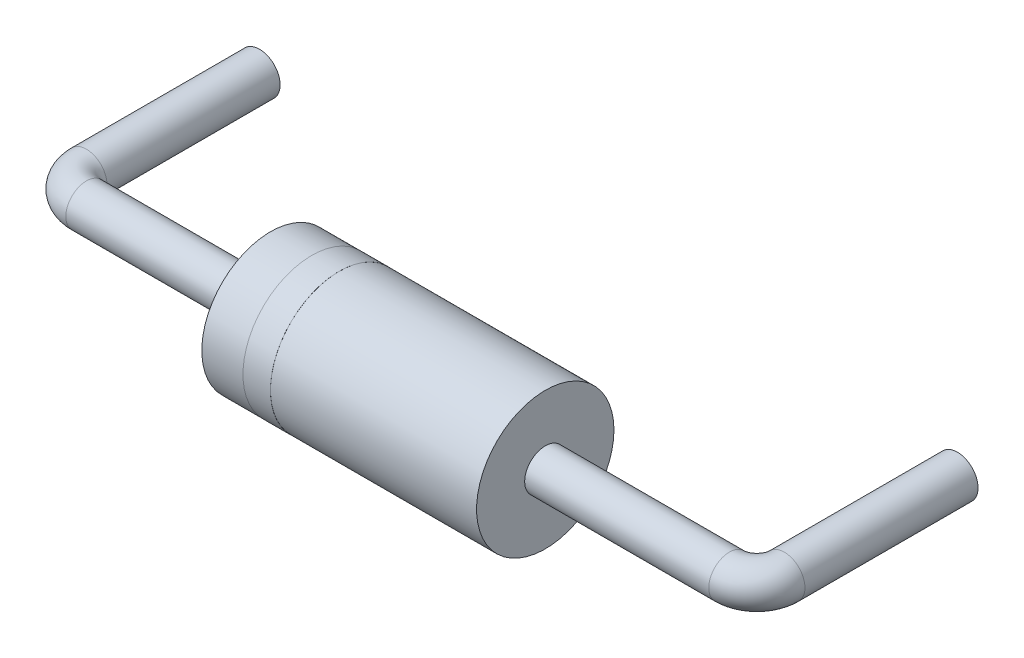
ISO-10303-21;
HEADER;
FILE_DESCRIPTION(('STEP AP214'),'2;1');
FILE_NAME('part.step','',(''),(''),'','','');
FILE_SCHEMA(('AUTOMOTIVE_DESIGN { 1 0 10303 214 1 1 1 1 }'));
ENDSEC;
DATA;
#1=APPLICATION_CONTEXT('core data for automotive mechanical design processes');
#2=APPLICATION_PROTOCOL_DEFINITION('international standard','automotive_design',2000,#1);
#3=PRODUCT_CONTEXT('',#1,'mechanical');
#4=PRODUCT('Part','Part','',(#3));
#5=PRODUCT_RELATED_PRODUCT_CATEGORY('part','',(#4));
#6=PRODUCT_DEFINITION_FORMATION('','',#4);
#7=PRODUCT_DEFINITION_CONTEXT('part definition',#1,'design');
#8=PRODUCT_DEFINITION('design','',#6,#7);
#9=PRODUCT_DEFINITION_SHAPE('','',#8);
#10=(LENGTH_UNIT() NAMED_UNIT(*) SI_UNIT(.MILLI.,.METRE.));
#11=(NAMED_UNIT(*) PLANE_ANGLE_UNIT() SI_UNIT($,.RADIAN.));
#12=(NAMED_UNIT(*) SI_UNIT($,.STERADIAN.) SOLID_ANGLE_UNIT());
#13=UNCERTAINTY_MEASURE_WITH_UNIT(LENGTH_MEASURE(1.E-05),#10,'distance_accuracy_value','');
#14=(GEOMETRIC_REPRESENTATION_CONTEXT(3) GLOBAL_UNCERTAINTY_ASSIGNED_CONTEXT((#13)) GLOBAL_UNIT_ASSIGNED_CONTEXT((#10,
#11,#12)) REPRESENTATION_CONTEXT('',''));
#15=CARTESIAN_POINT('',(0.,0.,0.));
#16=DIRECTION('',(0.,0.,1.));
#17=DIRECTION('',(1.,0.,0.));
#18=AXIS2_PLACEMENT_3D('',#15,#16,#17);
#19=CARTESIAN_POINT('',(2.,0.,0.919999999999982));
#20=DIRECTION('',(1.,0.,0.));
#21=DIRECTION('',(0.,0.,-1.));
#22=AXIS2_PLACEMENT_3D('',#19,#20,#21);
#23=PLANE('',#22);
#24=CARTESIAN_POINT('',(2.,0.,0.919999999999982));
#25=DIRECTION('',(1.,0.,0.));
#26=DIRECTION('',(0.,0.,-1.));
#27=AXIS2_PLACEMENT_3D('',#24,#25,#26);
#28=CIRCLE('',#27,1.);
#29=CARTESIAN_POINT('',(2.,0.,-0.0800000000000184));
#30=VERTEX_POINT('',#29);
#31=EDGE_CURVE('E75',#30,#30,#28,.T.);
#32=ORIENTED_EDGE('',*,*,#31,.T.);
#33=EDGE_LOOP('',(#32));
#34=FACE_BOUND('',#33,.T.);
#35=CARTESIAN_POINT('',(2.,0.,0.919999999999993));
#36=DIRECTION('',(1.,0.,0.));
#37=DIRECTION('',(0.,0.,-1.));
#38=AXIS2_PLACEMENT_3D('',#35,#36,#37);
#39=CIRCLE('',#38,0.3);
#40=CARTESIAN_POINT('',(2.,0.,0.619999999999993));
#41=VERTEX_POINT('',#40);
#42=EDGE_CURVE('E57',#41,#41,#39,.T.);
#43=ORIENTED_EDGE('',*,*,#42,.F.);
#44=EDGE_LOOP('',(#43));
#45=FACE_BOUND('',#44,.T.);
#46=ADVANCED_FACE('F39',(#34,#45),#23,.T.);
#47=CARTESIAN_POINT('',(-2.,0.,0.919999999999982));
#48=DIRECTION('',(1.,0.,0.));
#49=DIRECTION('',(0.,0.,-1.));
#50=AXIS2_PLACEMENT_3D('',#47,#48,#49);
#51=CYLINDRICAL_SURFACE('',#50,1.);
#52=CARTESIAN_POINT('',(-1.,0.,0.919999999999982));
#53=DIRECTION('',(1.,0.,0.));
#54=DIRECTION('',(0.,0.,-1.));
#55=AXIS2_PLACEMENT_3D('',#52,#53,#54);
#56=CIRCLE('',#55,1.);
#57=CARTESIAN_POINT('',(-1.,0.,-0.0800000000000184));
#58=VERTEX_POINT('',#57);
#59=EDGE_CURVE('E11',#58,#58,#56,.F.);
#60=ORIENTED_EDGE('',*,*,#59,.F.);
#61=EDGE_LOOP('',(#60));
#62=FACE_BOUND('',#61,.T.);
#63=ORIENTED_EDGE('',*,*,#31,.F.);
#64=EDGE_LOOP('',(#63));
#65=FACE_BOUND('',#64,.T.);
#66=ADVANCED_FACE('F97',(#62,#65),#51,.T.);
#67=CARTESIAN_POINT('',(5.07999999999999,0.,-2.00000000000004));
#68=DIRECTION('',(0.,0.,-1.));
#69=DIRECTION('',(-1.,0.,0.));
#70=AXIS2_PLACEMENT_3D('',#67,#68,#69);
#71=PLANE('',#70);
#72=CARTESIAN_POINT('',(5.07999999999999,0.,-2.00000000000004));
#73=DIRECTION('',(0.,0.,-1.));
#74=DIRECTION('',(-1.,0.,0.));
#75=AXIS2_PLACEMENT_3D('',#72,#73,#74);
#76=CIRCLE('',#75,0.3);
#77=CARTESIAN_POINT('',(4.77999999999999,0.,-2.00000000000003));
#78=VERTEX_POINT('',#77);
#79=EDGE_CURVE('E59',#78,#78,#76,.T.);
#80=ORIENTED_EDGE('',*,*,#79,.T.);
#81=EDGE_LOOP('',(#80));
#82=FACE_BOUND('',#81,.T.);
#83=ADVANCED_FACE('F107',(#82),#71,.T.);
#84=CARTESIAN_POINT('',(5.07999999999999,0.,0.519999999999993));
#85=DIRECTION('',(0.,0.,-1.));
#86=DIRECTION('',(-1.,0.,0.));
#87=AXIS2_PLACEMENT_3D('',#84,#85,#86);
#88=CYLINDRICAL_SURFACE('',#87,0.3);
#89=CARTESIAN_POINT('',(5.07999999999999,0.,0.519999999999993));
#90=DIRECTION('',(0.,0.,-1.));
#91=DIRECTION('',(-1.,0.,0.));
#92=AXIS2_PLACEMENT_3D('',#89,#90,#91);
#93=CIRCLE('',#92,0.3);
#94=CARTESIAN_POINT('',(5.37999999999999,0.,0.519999999999993));
#95=VERTEX_POINT('',#94);
#96=EDGE_CURVE('E70',#95,#95,#93,.T.);
#97=ORIENTED_EDGE('',*,*,#96,.T.);
#98=EDGE_LOOP('',(#97));
#99=FACE_BOUND('',#98,.T.);
#100=ORIENTED_EDGE('',*,*,#79,.F.);
#101=EDGE_LOOP('',(#100));
#102=FACE_BOUND('',#101,.T.);
#103=ADVANCED_FACE('F139',(#99,#102),#88,.T.);
#104=CARTESIAN_POINT('',(4.67999999999999,0.,0.519999999999993));
#105=DIRECTION('',(0.,-1.,0.));
#106=DIRECTION('',(0.,0.,-1.));
#107=AXIS2_PLACEMENT_3D('',#104,#105,#106);
#108=TOROIDAL_SURFACE('',#107,0.4,0.3);
#109=CARTESIAN_POINT('',(4.67999999999999,0.,0.919999999999993));
#110=DIRECTION('',(1.,0.,0.));
#111=DIRECTION('',(0.,0.,-1.));
#112=AXIS2_PLACEMENT_3D('',#109,#110,#111);
#113=CIRCLE('',#112,0.3);
#114=CARTESIAN_POINT('',(4.67999999999998,0.,1.21999999999999));
#115=VERTEX_POINT('',#114);
#116=EDGE_CURVE('E67',#115,#115,#113,.T.);
#117=CARTESIAN_POINT('',(4.67999999999999,0.,0.519999999999993));
#118=DIRECTION('',(0.,-1.,0.));
#119=DIRECTION('',(0.,0.,-1.));
#120=AXIS2_PLACEMENT_3D('',#117,#118,#119);
#121=CIRCLE('',#120,0.7);
#122=EDGE_CURVE('',#95,#115,#121,.T.);
#123=ORIENTED_EDGE('',*,*,#96,.F.);
#124=ORIENTED_EDGE('',*,*,#116,.T.);
#125=ORIENTED_EDGE('',*,*,#122,.T.);
#126=ORIENTED_EDGE('',*,*,#122,.F.);
#127=EDGE_LOOP('',(#123,#125,#124,#126));
#128=FACE_BOUND('',#127,.T.);
#129=ADVANCED_FACE('F130',(#128),#108,.T.);
#130=CARTESIAN_POINT('',(4.67999999999999,0.,0.919999999999993));
#131=DIRECTION('',(-1.,0.,0.));
#132=DIRECTION('',(0.,0.,1.));
#133=AXIS2_PLACEMENT_3D('',#130,#131,#132);
#134=CYLINDRICAL_SURFACE('',#133,0.3);
#135=ORIENTED_EDGE('',*,*,#42,.T.);
#136=EDGE_LOOP('',(#135));
#137=FACE_BOUND('',#136,.T.);
#138=ORIENTED_EDGE('',*,*,#116,.F.);
#139=EDGE_LOOP('',(#138));
#140=FACE_BOUND('',#139,.T.);
#141=ADVANCED_FACE('F125',(#137,#140),#134,.T.);
#142=CARTESIAN_POINT('',(-1.,0.,0.919999999999982));
#143=DIRECTION('',(1.,0.,0.));
#144=DIRECTION('',(0.,0.,-1.));
#145=AXIS2_PLACEMENT_3D('',#142,#143,#144);
#146=PLANE('',#145);
#147=CARTESIAN_POINT('',(-1.,0.,0.919999999999982));
#148=DIRECTION('',(1.,0.,0.));
#149=DIRECTION('',(0.,0.,-1.));
#150=AXIS2_PLACEMENT_3D('',#147,#148,#149);
#151=CIRCLE('',#150,1.001);
#152=CARTESIAN_POINT('',(-1.,0.,-0.0810000000000183));
#153=VERTEX_POINT('',#152);
#154=EDGE_CURVE('E78',#153,#153,#151,.T.);
#155=ORIENTED_EDGE('',*,*,#154,.T.);
#156=EDGE_LOOP('',(#155));
#157=FACE_BOUND('',#156,.T.);
#158=ORIENTED_EDGE('',*,*,#59,.T.);
#159=EDGE_LOOP('',(#158));
#160=FACE_BOUND('',#159,.T.);
#161=ADVANCED_FACE('F122',(#157,#160),#146,.T.);
#162=CARTESIAN_POINT('',(-1.4,0.,0.919999999999982));
#163=DIRECTION('',(1.,0.,0.));
#164=DIRECTION('',(0.,0.,-1.));
#165=AXIS2_PLACEMENT_3D('',#162,#163,#164);
#166=PLANE('',#165);
#167=CARTESIAN_POINT('',(-1.4,0.,0.919999999999982));
#168=DIRECTION('',(1.,0.,0.));
#169=DIRECTION('',(0.,0.,-1.));
#170=AXIS2_PLACEMENT_3D('',#167,#168,#169);
#171=CIRCLE('',#170,1.001);
#172=CARTESIAN_POINT('',(-1.4,0.,-0.0810000000000183));
#173=VERTEX_POINT('',#172);
#174=EDGE_CURVE('E81',#173,#173,#171,.T.);
#175=ORIENTED_EDGE('',*,*,#174,.F.);
#176=EDGE_LOOP('',(#175));
#177=FACE_BOUND('',#176,.T.);
#178=CARTESIAN_POINT('',(-1.4,0.,0.919999999999982));
#179=DIRECTION('',(1.,0.,0.));
#180=DIRECTION('',(0.,0.,-1.));
#181=AXIS2_PLACEMENT_3D('',#178,#179,#180);
#182=CIRCLE('',#181,1.);
#183=CARTESIAN_POINT('',(-1.4,0.,-0.0800000000000184));
#184=VERTEX_POINT('',#183);
#185=EDGE_CURVE('E84',#184,#184,#182,.T.);
#186=ORIENTED_EDGE('',*,*,#185,.T.);
#187=EDGE_LOOP('',(#186));
#188=FACE_BOUND('',#187,.T.);
#189=ADVANCED_FACE('F90',(#177,#188),#166,.F.);
#190=CARTESIAN_POINT('',(-1.,0.,0.919999999999982));
#191=DIRECTION('',(-1.,0.,0.));
#192=DIRECTION('',(0.,0.,1.));
#193=AXIS2_PLACEMENT_3D('',#190,#191,#192);
#194=CYLINDRICAL_SURFACE('',#193,1.001);
#195=ORIENTED_EDGE('',*,*,#154,.F.);
#196=EDGE_LOOP('',(#195));
#197=FACE_BOUND('',#196,.T.);
#198=ORIENTED_EDGE('',*,*,#174,.T.);
#199=EDGE_LOOP('',(#198));
#200=FACE_BOUND('',#199,.T.);
#201=ADVANCED_FACE('F115',(#197,#200),#194,.T.);
#202=CARTESIAN_POINT('',(-5.08000000000001,0.,-1.99999999999997));
#203=DIRECTION('',(1.82076576038526E-13,0.,1.));
#204=DIRECTION('',(1.,0.,-1.82076576038526E-13));
#205=AXIS2_PLACEMENT_3D('',#202,#203,#204);
#206=PLANE('',#205);
#207=CARTESIAN_POINT('',(-5.08000000000001,0.,-1.99999999999997));
#208=DIRECTION('',(1.82076576038526E-13,0.,1.));
#209=DIRECTION('',(1.,0.,-1.82076576038526E-13));
#210=AXIS2_PLACEMENT_3D('',#207,#208,#209);
#211=CIRCLE('',#210,0.3);
#212=CARTESIAN_POINT('',(-4.78000000000001,0.,-2.00000000000002));
#213=VERTEX_POINT('',#212);
#214=EDGE_CURVE('E50',#213,#213,#211,.T.);
#215=ORIENTED_EDGE('',*,*,#214,.F.);
#216=EDGE_LOOP('',(#215));
#217=FACE_BOUND('',#216,.T.);
#218=ADVANCED_FACE('F118',(#217),#206,.F.);
#219=CARTESIAN_POINT('',(-5.08000000000001,0.,0.520000000000063));
#220=DIRECTION('',(0.,0.,-1.));
#221=DIRECTION('',(-1.,0.,0.));
#222=AXIS2_PLACEMENT_3D('',#219,#220,#221);
#223=CYLINDRICAL_SURFACE('',#222,0.3);
#224=CARTESIAN_POINT('',(-5.08000000000001,0.,0.520000000000063));
#225=DIRECTION('',(1.82076576038526E-13,0.,1.));
#226=DIRECTION('',(1.,0.,-1.82076576038526E-13));
#227=AXIS2_PLACEMENT_3D('',#224,#225,#226);
#228=CIRCLE('',#227,0.3);
#229=CARTESIAN_POINT('',(-5.38000000000001,0.,0.520000000000115));
#230=VERTEX_POINT('',#229);
#231=EDGE_CURVE('E54',#230,#230,#228,.T.);
#232=ORIENTED_EDGE('',*,*,#231,.F.);
#233=EDGE_LOOP('',(#232));
#234=FACE_BOUND('',#233,.T.);
#235=ORIENTED_EDGE('',*,*,#214,.T.);
#236=EDGE_LOOP('',(#235));
#237=FACE_BOUND('',#236,.T.);
#238=ADVANCED_FACE('F41',(#234,#237),#223,.T.);
#239=CARTESIAN_POINT('',(-4.68000000000001,0.,0.519999999999994));
#240=DIRECTION('',(0.,-1.,0.));
#241=DIRECTION('',(0.,0.,-1.));
#242=AXIS2_PLACEMENT_3D('',#239,#240,#241);
#243=TOROIDAL_SURFACE('',#242,0.4,0.3);
#244=CARTESIAN_POINT('',(-4.68000000000001,0.,0.919999999999994));
#245=DIRECTION('',(1.,0.,0.));
#246=DIRECTION('',(0.,0.,-1.));
#247=AXIS2_PLACEMENT_3D('',#244,#245,#246);
#248=CIRCLE('',#247,0.3);
#249=CARTESIAN_POINT('',(-4.68000000000002,0.,1.21999999999999));
#250=VERTEX_POINT('',#249);
#251=EDGE_CURVE('E64',#250,#250,#248,.T.);
#252=CARTESIAN_POINT('',(-4.68000000000001,0.,0.519999999999994));
#253=DIRECTION('',(0.,-1.,0.));
#254=DIRECTION('',(0.,0.,-1.));
#255=AXIS2_PLACEMENT_3D('',#252,#253,#254);
#256=CIRCLE('',#255,0.7);
#257=EDGE_CURVE('',#250,#230,#256,.T.);
#258=ORIENTED_EDGE('',*,*,#251,.F.);
#259=ORIENTED_EDGE('',*,*,#231,.T.);
#260=ORIENTED_EDGE('',*,*,#257,.T.);
#261=ORIENTED_EDGE('',*,*,#257,.F.);
#262=EDGE_LOOP('',(#258,#260,#259,#261));
#263=FACE_BOUND('',#262,.T.);
#264=ADVANCED_FACE('F144',(#263),#243,.T.);
#265=ORIENTED_EDGE('',*,*,#251,.T.);
#266=EDGE_LOOP('',(#265));
#267=FACE_BOUND('',#266,.T.);
#268=CARTESIAN_POINT('',(-2.,0.,0.919999999999993));
#269=DIRECTION('',(1.,0.,0.));
#270=DIRECTION('',(0.,0.,-1.));
#271=AXIS2_PLACEMENT_3D('',#268,#269,#270);
#272=CIRCLE('',#271,0.3);
#273=CARTESIAN_POINT('',(-2.,0.,0.619999999999993));
#274=VERTEX_POINT('',#273);
#275=EDGE_CURVE('E46',#274,#274,#272,.T.);
#276=ORIENTED_EDGE('',*,*,#275,.F.);
#277=EDGE_LOOP('',(#276));
#278=FACE_BOUND('',#277,.T.);
#279=ADVANCED_FACE('F101',(#267,#278),#134,.T.);
#280=CARTESIAN_POINT('',(-2.,0.,0.919999999999982));
#281=DIRECTION('',(1.,0.,0.));
#282=DIRECTION('',(0.,0.,-1.));
#283=AXIS2_PLACEMENT_3D('',#280,#281,#282);
#284=PLANE('',#283);
#285=CARTESIAN_POINT('',(-2.,0.,0.919999999999982));
#286=DIRECTION('',(1.,0.,0.));
#287=DIRECTION('',(0.,0.,-1.));
#288=AXIS2_PLACEMENT_3D('',#285,#286,#287);
#289=CIRCLE('',#288,1.);
#290=CARTESIAN_POINT('',(-2.,0.,-0.0800000000000184));
#291=VERTEX_POINT('',#290);
#292=EDGE_CURVE('E60',#291,#291,#289,.T.);
#293=ORIENTED_EDGE('',*,*,#292,.F.);
#294=EDGE_LOOP('',(#293));
#295=FACE_BOUND('',#294,.T.);
#296=ORIENTED_EDGE('',*,*,#275,.T.);
#297=EDGE_LOOP('',(#296));
#298=FACE_BOUND('',#297,.T.);
#299=ADVANCED_FACE('F94',(#295,#298),#284,.F.);
#300=ORIENTED_EDGE('',*,*,#292,.T.);
#301=EDGE_LOOP('',(#300));
#302=FACE_BOUND('',#301,.T.);
#303=ORIENTED_EDGE('',*,*,#185,.F.);
#304=EDGE_LOOP('',(#303));
#305=FACE_BOUND('',#304,.T.);
#306=ADVANCED_FACE('F92',(#302,#305),#51,.T.);
#307=CLOSED_SHELL('',(#46,#66,#83,#103,#129,#141,#161,#189,#201,#218,#238,#264,#279,#299,#306));
#308=MANIFOLD_SOLID_BREP('B2',#307);
#309=ADVANCED_BREP_SHAPE_REPRESENTATION('',(#18,#308),#14);
#310=SHAPE_DEFINITION_REPRESENTATION(#9,#309);
ENDSEC;
END-ISO-10303-21;
